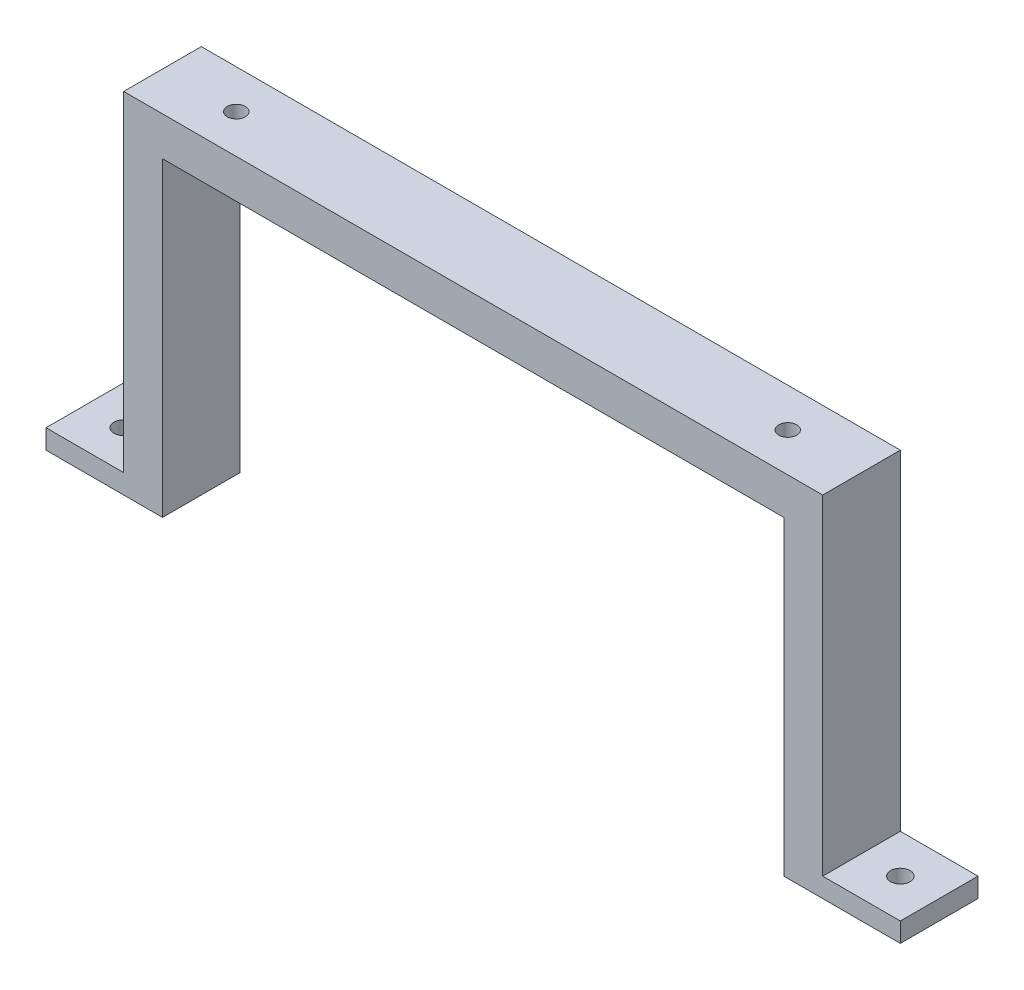
ISO-10303-21;
HEADER;
FILE_DESCRIPTION(('STEP AP214'),'2;1');
FILE_NAME('part.step','',(''),(''),'','','');
FILE_SCHEMA(('AUTOMOTIVE_DESIGN { 1 0 10303 214 1 1 1 1 }'));
ENDSEC;
DATA;
#1=APPLICATION_CONTEXT('core data for automotive mechanical design processes');
#2=APPLICATION_PROTOCOL_DEFINITION('international standard','automotive_design',2000,#1);
#3=PRODUCT_CONTEXT('',#1,'mechanical');
#4=PRODUCT('Part','Part','',(#3));
#5=PRODUCT_RELATED_PRODUCT_CATEGORY('part','',(#4));
#6=PRODUCT_DEFINITION_FORMATION('','',#4);
#7=PRODUCT_DEFINITION_CONTEXT('part definition',#1,'design');
#8=PRODUCT_DEFINITION('design','',#6,#7);
#9=PRODUCT_DEFINITION_SHAPE('','',#8);
#10=(LENGTH_UNIT() NAMED_UNIT(*) SI_UNIT(.MILLI.,.METRE.));
#11=(NAMED_UNIT(*) PLANE_ANGLE_UNIT() SI_UNIT($,.RADIAN.));
#12=(NAMED_UNIT(*) SI_UNIT($,.STERADIAN.) SOLID_ANGLE_UNIT());
#13=UNCERTAINTY_MEASURE_WITH_UNIT(LENGTH_MEASURE(1.E-05),#10,'distance_accuracy_value','');
#14=(GEOMETRIC_REPRESENTATION_CONTEXT(3) GLOBAL_UNCERTAINTY_ASSIGNED_CONTEXT((#13)) GLOBAL_UNIT_ASSIGNED_CONTEXT((#10,
#11,#12)) REPRESENTATION_CONTEXT('',''));
#15=CARTESIAN_POINT('',(0.,0.,0.));
#16=DIRECTION('',(0.,0.,1.));
#17=DIRECTION('',(1.,0.,0.));
#18=AXIS2_PLACEMENT_3D('',#15,#16,#17);
#19=CARTESIAN_POINT('',(-57.15,6.35,-6.35));
#20=DIRECTION('',(1.,0.,0.));
#21=DIRECTION('',(0.,0.,-1.));
#22=AXIS2_PLACEMENT_3D('',#19,#20,#21);
#23=PLANE('',#22);
#24=DIRECTION('',(0.,0.,-1.));
#25=VECTOR('',#24,1.);
#26=CARTESIAN_POINT('',(-57.15,-47.625,-6.35));
#27=LINE('',#26,#25);
#28=CARTESIAN_POINT('',(-57.15,-47.625,6.35));
#29=VERTEX_POINT('',#28);
#30=CARTESIAN_POINT('',(-57.15,-47.625,-6.35));
#31=VERTEX_POINT('',#30);
#32=EDGE_CURVE('E56',#29,#31,#27,.T.);
#33=ORIENTED_EDGE('',*,*,#32,.F.);
#34=DIRECTION('',(0.,-1.,0.));
#35=VECTOR('',#34,1.);
#36=CARTESIAN_POINT('',(-57.15,6.35,6.35));
#37=LINE('',#36,#35);
#38=CARTESIAN_POINT('',(-57.15,6.35,6.35));
#39=VERTEX_POINT('',#38);
#40=EDGE_CURVE('E214',#39,#29,#37,.T.);
#41=ORIENTED_EDGE('',*,*,#40,.F.);
#42=DIRECTION('',(0.,0.,1.));
#43=VECTOR('',#42,1.);
#44=CARTESIAN_POINT('',(-57.15,6.35,-6.35));
#45=LINE('',#44,#43);
#46=CARTESIAN_POINT('',(-57.15,6.35,-6.35));
#47=VERTEX_POINT('',#46);
#48=EDGE_CURVE('E204',#47,#39,#45,.T.);
#49=ORIENTED_EDGE('',*,*,#48,.F.);
#50=DIRECTION('',(0.,-1.,0.));
#51=VECTOR('',#50,1.);
#52=CARTESIAN_POINT('',(-57.15,6.35,-6.35));
#53=LINE('',#52,#51);
#54=EDGE_CURVE('E41',#47,#31,#53,.T.);
#55=ORIENTED_EDGE('',*,*,#54,.T.);
#56=EDGE_LOOP('',(#33,#41,#49,#55));
#57=FACE_BOUND('',#56,.T.);
#58=ADVANCED_FACE('F33',(#57),#23,.F.);
#59=CARTESIAN_POINT('',(0.,0.,0.));
#60=DIRECTION('',(0.,1.,0.));
#61=DIRECTION('',(0.,0.,1.));
#62=AXIS2_PLACEMENT_3D('',#59,#60,#61);
#63=PLANE('',#62);
#64=CARTESIAN_POINT('',(-45.085,0.,0.));
#65=DIRECTION('',(0.,1.,0.));
#66=DIRECTION('',(0.,0.,1.));
#67=AXIS2_PLACEMENT_3D('',#64,#65,#66);
#68=CIRCLE('',#67,1.4732);
#69=CARTESIAN_POINT('',(-45.085,0.,1.4732));
#70=VERTEX_POINT('',#69);
#71=EDGE_CURVE('E305',#70,#70,#68,.F.);
#72=ORIENTED_EDGE('',*,*,#71,.F.);
#73=EDGE_LOOP('',(#72));
#74=FACE_BOUND('',#73,.T.);
#75=CARTESIAN_POINT('',(45.085,0.,0.));
#76=DIRECTION('',(0.,1.,0.));
#77=DIRECTION('',(0.,0.,1.));
#78=AXIS2_PLACEMENT_3D('',#75,#76,#77);
#79=CIRCLE('',#78,1.4732);
#80=CARTESIAN_POINT('',(45.085,0.,1.4732));
#81=VERTEX_POINT('',#80);
#82=EDGE_CURVE('E311',#81,#81,#79,.F.);
#83=ORIENTED_EDGE('',*,*,#82,.F.);
#84=EDGE_LOOP('',(#83));
#85=FACE_BOUND('',#84,.T.);
#86=DIRECTION('',(-1.,0.,0.));
#87=VECTOR('',#86,1.);
#88=CARTESIAN_POINT('',(-57.15,0.,-6.35));
#89=LINE('',#88,#87);
#90=CARTESIAN_POINT('',(50.8,0.,-6.35));
#91=VERTEX_POINT('',#90);
#92=CARTESIAN_POINT('',(-50.8,0.,-6.35));
#93=VERTEX_POINT('',#92);
#94=EDGE_CURVE('E197',#91,#93,#89,.T.);
#95=ORIENTED_EDGE('',*,*,#94,.F.);
#96=DIRECTION('',(0.,0.,1.));
#97=VECTOR('',#96,1.);
#98=CARTESIAN_POINT('',(50.8,0.,6.35));
#99=LINE('',#98,#97);
#100=CARTESIAN_POINT('',(50.8,0.,6.35));
#101=VERTEX_POINT('',#100);
#102=EDGE_CURVE('E129',#91,#101,#99,.T.);
#103=ORIENTED_EDGE('',*,*,#102,.T.);
#104=DIRECTION('',(1.,0.,0.));
#105=VECTOR('',#104,1.);
#106=CARTESIAN_POINT('',(-57.15,0.,6.35));
#107=LINE('',#106,#105);
#108=CARTESIAN_POINT('',(-50.8,0.,6.35));
#109=VERTEX_POINT('',#108);
#110=EDGE_CURVE('E202',#109,#101,#107,.T.);
#111=ORIENTED_EDGE('',*,*,#110,.F.);
#112=DIRECTION('',(0.,0.,1.));
#113=VECTOR('',#112,1.);
#114=CARTESIAN_POINT('',(-50.8,0.,6.35));
#115=LINE('',#114,#113);
#116=EDGE_CURVE('E182',#93,#109,#115,.T.);
#117=ORIENTED_EDGE('',*,*,#116,.F.);
#118=EDGE_LOOP('',(#95,#103,#111,#117));
#119=FACE_BOUND('',#118,.T.);
#120=ADVANCED_FACE('F238',(#74,#85,#119),#63,.F.);
#121=CARTESIAN_POINT('',(57.15,6.35,-6.35));
#122=DIRECTION('',(-1.,0.,0.));
#123=DIRECTION('',(0.,0.,1.));
#124=AXIS2_PLACEMENT_3D('',#121,#122,#123);
#125=PLANE('',#124);
#126=DIRECTION('',(0.,-1.,0.));
#127=VECTOR('',#126,1.);
#128=CARTESIAN_POINT('',(57.15,6.35,6.35));
#129=LINE('',#128,#127);
#130=CARTESIAN_POINT('',(57.15,6.35,6.35));
#131=VERTEX_POINT('',#130);
#132=CARTESIAN_POINT('',(57.15,-47.625,6.35));
#133=VERTEX_POINT('',#132);
#134=EDGE_CURVE('E208',#131,#133,#129,.T.);
#135=ORIENTED_EDGE('',*,*,#134,.T.);
#136=DIRECTION('',(0.,0.,-1.));
#137=VECTOR('',#136,1.);
#138=CARTESIAN_POINT('',(57.15,-47.625,-6.35));
#139=LINE('',#138,#137);
#140=CARTESIAN_POINT('',(57.15,-47.625,-6.35));
#141=VERTEX_POINT('',#140);
#142=EDGE_CURVE('E140',#133,#141,#139,.T.);
#143=ORIENTED_EDGE('',*,*,#142,.T.);
#144=DIRECTION('',(0.,-1.,0.));
#145=VECTOR('',#144,1.);
#146=CARTESIAN_POINT('',(57.15,6.35,-6.35));
#147=LINE('',#146,#145);
#148=CARTESIAN_POINT('',(57.15,6.35,-6.35));
#149=VERTEX_POINT('',#148);
#150=EDGE_CURVE('E11',#149,#141,#147,.T.);
#151=ORIENTED_EDGE('',*,*,#150,.F.);
#152=DIRECTION('',(0.,0.,-1.));
#153=VECTOR('',#152,1.);
#154=CARTESIAN_POINT('',(57.15,6.35,-6.35));
#155=LINE('',#154,#153);
#156=EDGE_CURVE('E198',#131,#149,#155,.T.);
#157=ORIENTED_EDGE('',*,*,#156,.F.);
#158=EDGE_LOOP('',(#135,#143,#151,#157));
#159=FACE_BOUND('',#158,.T.);
#160=ADVANCED_FACE('F35',(#159),#125,.F.);
#161=CARTESIAN_POINT('',(-57.15,6.35,-6.35));
#162=DIRECTION('',(0.,0.,1.));
#163=DIRECTION('',(1.,0.,0.));
#164=AXIS2_PLACEMENT_3D('',#161,#162,#163);
#165=PLANE('',#164);
#166=ORIENTED_EDGE('',*,*,#150,.T.);
#167=DIRECTION('',(-1.,0.,0.));
#168=VECTOR('',#167,1.);
#169=CARTESIAN_POINT('',(69.85,-47.625,-6.35));
#170=LINE('',#169,#168);
#171=CARTESIAN_POINT('',(69.85,-47.625,-6.35));
#172=VERTEX_POINT('',#171);
#173=EDGE_CURVE('E48',#172,#141,#170,.T.);
#174=ORIENTED_EDGE('',*,*,#173,.F.);
#175=DIRECTION('',(0.,-1.,0.));
#176=VECTOR('',#175,1.);
#177=CARTESIAN_POINT('',(69.85,-50.8,-6.35));
#178=LINE('',#177,#176);
#179=CARTESIAN_POINT('',(69.85,-50.8,-6.35));
#180=VERTEX_POINT('',#179);
#181=EDGE_CURVE('E126',#172,#180,#178,.T.);
#182=ORIENTED_EDGE('',*,*,#181,.T.);
#183=DIRECTION('',(-1.,0.,0.));
#184=VECTOR('',#183,1.);
#185=CARTESIAN_POINT('',(57.15,-50.8,-6.35));
#186=LINE('',#185,#184);
#187=CARTESIAN_POINT('',(50.8,-50.8,-6.35));
#188=VERTEX_POINT('',#187);
#189=EDGE_CURVE('E157',#180,#188,#186,.T.);
#190=ORIENTED_EDGE('',*,*,#189,.T.);
#191=DIRECTION('',(0.,1.,0.));
#192=VECTOR('',#191,1.);
#193=CARTESIAN_POINT('',(50.8,-50.8,-6.35));
#194=LINE('',#193,#192);
#195=EDGE_CURVE('E159',#188,#91,#194,.T.);
#196=ORIENTED_EDGE('',*,*,#195,.T.);
#197=ORIENTED_EDGE('',*,*,#94,.T.);
#198=DIRECTION('',(0.,1.,0.));
#199=VECTOR('',#198,1.);
#200=CARTESIAN_POINT('',(-50.8,-50.8,-6.35));
#201=LINE('',#200,#199);
#202=CARTESIAN_POINT('',(-50.8,-50.8,-6.35));
#203=VERTEX_POINT('',#202);
#204=EDGE_CURVE('E194',#203,#93,#201,.T.);
#205=ORIENTED_EDGE('',*,*,#204,.F.);
#206=DIRECTION('',(1.,0.,0.));
#207=VECTOR('',#206,1.);
#208=CARTESIAN_POINT('',(-57.15,-50.8,-6.35));
#209=LINE('',#208,#207);
#210=CARTESIAN_POINT('',(-69.85,-50.8,-6.35));
#211=VERTEX_POINT('',#210);
#212=EDGE_CURVE('E183',#211,#203,#209,.T.);
#213=ORIENTED_EDGE('',*,*,#212,.F.);
#214=DIRECTION('',(0.,-1.,0.));
#215=VECTOR('',#214,1.);
#216=CARTESIAN_POINT('',(-69.85,-50.8,-6.35));
#217=LINE('',#216,#215);
#218=CARTESIAN_POINT('',(-69.85,-47.625,-6.35));
#219=VERTEX_POINT('',#218);
#220=EDGE_CURVE('E165',#219,#211,#217,.T.);
#221=ORIENTED_EDGE('',*,*,#220,.F.);
#222=DIRECTION('',(1.,0.,0.));
#223=VECTOR('',#222,1.);
#224=CARTESIAN_POINT('',(-69.85,-47.625,-6.35));
#225=LINE('',#224,#223);
#226=EDGE_CURVE('E175',#219,#31,#225,.T.);
#227=ORIENTED_EDGE('',*,*,#226,.T.);
#228=ORIENTED_EDGE('',*,*,#54,.F.);
#229=DIRECTION('',(-1.,0.,0.));
#230=VECTOR('',#229,1.);
#231=CARTESIAN_POINT('',(-57.15,6.35,-6.35));
#232=LINE('',#231,#230);
#233=EDGE_CURVE('E201',#149,#47,#232,.T.);
#234=ORIENTED_EDGE('',*,*,#233,.F.);
#235=EDGE_LOOP('',(#166,#174,#182,#190,#196,#197,#205,#213,#221,#227,#228,#234));
#236=FACE_BOUND('',#235,.T.);
#237=ADVANCED_FACE('F124',(#236),#165,.F.);
#238=CARTESIAN_POINT('',(-57.15,6.35,6.35));
#239=DIRECTION('',(0.,0.,-1.));
#240=DIRECTION('',(-1.,0.,0.));
#241=AXIS2_PLACEMENT_3D('',#238,#239,#240);
#242=PLANE('',#241);
#243=ORIENTED_EDGE('',*,*,#40,.T.);
#244=DIRECTION('',(1.,0.,0.));
#245=VECTOR('',#244,1.);
#246=CARTESIAN_POINT('',(-69.85,-47.625,6.35));
#247=LINE('',#246,#245);
#248=CARTESIAN_POINT('',(-69.85,-47.625,6.35));
#249=VERTEX_POINT('',#248);
#250=EDGE_CURVE('E179',#249,#29,#247,.T.);
#251=ORIENTED_EDGE('',*,*,#250,.F.);
#252=DIRECTION('',(0.,1.,0.));
#253=VECTOR('',#252,1.);
#254=CARTESIAN_POINT('',(-69.85,-50.8,6.35));
#255=LINE('',#254,#253);
#256=CARTESIAN_POINT('',(-69.85,-50.8,6.35));
#257=VERTEX_POINT('',#256);
#258=EDGE_CURVE('E171',#257,#249,#255,.T.);
#259=ORIENTED_EDGE('',*,*,#258,.F.);
#260=DIRECTION('',(-1.,0.,0.));
#261=VECTOR('',#260,1.);
#262=CARTESIAN_POINT('',(-57.15,-50.8,6.35));
#263=LINE('',#262,#261);
#264=CARTESIAN_POINT('',(-50.8,-50.8,6.35));
#265=VERTEX_POINT('',#264);
#266=EDGE_CURVE('E187',#265,#257,#263,.T.);
#267=ORIENTED_EDGE('',*,*,#266,.F.);
#268=DIRECTION('',(0.,1.,0.));
#269=VECTOR('',#268,1.);
#270=CARTESIAN_POINT('',(-50.8,-50.8,6.35));
#271=LINE('',#270,#269);
#272=EDGE_CURVE('E189',#265,#109,#271,.T.);
#273=ORIENTED_EDGE('',*,*,#272,.T.);
#274=ORIENTED_EDGE('',*,*,#110,.T.);
#275=DIRECTION('',(0.,1.,0.));
#276=VECTOR('',#275,1.);
#277=CARTESIAN_POINT('',(50.8,-50.8,6.35));
#278=LINE('',#277,#276);
#279=CARTESIAN_POINT('',(50.8,-50.8,6.35));
#280=VERTEX_POINT('',#279);
#281=EDGE_CURVE('E163',#280,#101,#278,.T.);
#282=ORIENTED_EDGE('',*,*,#281,.F.);
#283=DIRECTION('',(1.,0.,0.));
#284=VECTOR('',#283,1.);
#285=CARTESIAN_POINT('',(57.15,-50.8,6.35));
#286=LINE('',#285,#284);
#287=CARTESIAN_POINT('',(69.85,-50.8,6.35));
#288=VERTEX_POINT('',#287);
#289=EDGE_CURVE('E152',#280,#288,#286,.T.);
#290=ORIENTED_EDGE('',*,*,#289,.T.);
#291=DIRECTION('',(0.,1.,0.));
#292=VECTOR('',#291,1.);
#293=CARTESIAN_POINT('',(69.85,-50.8,6.35));
#294=LINE('',#293,#292);
#295=CARTESIAN_POINT('',(69.85,-47.625,6.35));
#296=VERTEX_POINT('',#295);
#297=EDGE_CURVE('E143',#288,#296,#294,.T.);
#298=ORIENTED_EDGE('',*,*,#297,.T.);
#299=DIRECTION('',(-1.,0.,0.));
#300=VECTOR('',#299,1.);
#301=CARTESIAN_POINT('',(69.85,-47.625,6.35));
#302=LINE('',#301,#300);
#303=EDGE_CURVE('E130',#296,#133,#302,.T.);
#304=ORIENTED_EDGE('',*,*,#303,.T.);
#305=ORIENTED_EDGE('',*,*,#134,.F.);
#306=DIRECTION('',(1.,0.,0.));
#307=VECTOR('',#306,1.);
#308=CARTESIAN_POINT('',(-57.15,6.35,6.35));
#309=LINE('',#308,#307);
#310=EDGE_CURVE('E206',#39,#131,#309,.T.);
#311=ORIENTED_EDGE('',*,*,#310,.F.);
#312=EDGE_LOOP('',(#243,#251,#259,#267,#273,#274,#282,#290,#298,#304,#305,#311));
#313=FACE_BOUND('',#312,.T.);
#314=ADVANCED_FACE('F230',(#313),#242,.F.);
#315=CARTESIAN_POINT('',(0.,6.35,0.));
#316=DIRECTION('',(0.,1.,0.));
#317=DIRECTION('',(0.,0.,1.));
#318=AXIS2_PLACEMENT_3D('',#315,#316,#317);
#319=PLANE('',#318);
#320=CARTESIAN_POINT('',(-45.085,6.35,0.));
#321=DIRECTION('',(0.,1.,0.));
#322=DIRECTION('',(0.,0.,1.));
#323=AXIS2_PLACEMENT_3D('',#320,#321,#322);
#324=CIRCLE('',#323,1.4732);
#325=CARTESIAN_POINT('',(-45.085,6.35,1.4732));
#326=VERTEX_POINT('',#325);
#327=EDGE_CURVE('E302',#326,#326,#324,.T.);
#328=ORIENTED_EDGE('',*,*,#327,.F.);
#329=EDGE_LOOP('',(#328));
#330=FACE_BOUND('',#329,.T.);
#331=CARTESIAN_POINT('',(45.085,6.35,0.));
#332=DIRECTION('',(0.,1.,0.));
#333=DIRECTION('',(0.,0.,1.));
#334=AXIS2_PLACEMENT_3D('',#331,#332,#333);
#335=CIRCLE('',#334,1.4732);
#336=CARTESIAN_POINT('',(45.085,6.35,1.4732));
#337=VERTEX_POINT('',#336);
#338=EDGE_CURVE('E314',#337,#337,#335,.T.);
#339=ORIENTED_EDGE('',*,*,#338,.F.);
#340=EDGE_LOOP('',(#339));
#341=FACE_BOUND('',#340,.T.);
#342=ORIENTED_EDGE('',*,*,#156,.T.);
#343=ORIENTED_EDGE('',*,*,#233,.T.);
#344=ORIENTED_EDGE('',*,*,#48,.T.);
#345=ORIENTED_EDGE('',*,*,#310,.T.);
#346=EDGE_LOOP('',(#342,#343,#344,#345));
#347=FACE_BOUND('',#346,.T.);
#348=ADVANCED_FACE('F235',(#330,#341,#347),#319,.T.);
#349=CARTESIAN_POINT('',(-50.8,-50.8,6.35));
#350=DIRECTION('',(-1.,0.,0.));
#351=DIRECTION('',(0.,0.,1.));
#352=AXIS2_PLACEMENT_3D('',#349,#350,#351);
#353=PLANE('',#352);
#354=ORIENTED_EDGE('',*,*,#116,.T.);
#355=ORIENTED_EDGE('',*,*,#272,.F.);
#356=DIRECTION('',(0.,0.,1.));
#357=VECTOR('',#356,1.);
#358=CARTESIAN_POINT('',(-50.8,-50.8,6.35));
#359=LINE('',#358,#357);
#360=EDGE_CURVE('E185',#203,#265,#359,.T.);
#361=ORIENTED_EDGE('',*,*,#360,.F.);
#362=ORIENTED_EDGE('',*,*,#204,.T.);
#363=EDGE_LOOP('',(#354,#355,#361,#362));
#364=FACE_BOUND('',#363,.T.);
#365=ADVANCED_FACE('F255',(#364),#353,.F.);
#366=CARTESIAN_POINT('',(0.,-50.8,0.));
#367=DIRECTION('',(0.,-1.,0.));
#368=DIRECTION('',(0.,0.,-1.));
#369=AXIS2_PLACEMENT_3D('',#366,#367,#368);
#370=PLANE('',#369);
#371=CARTESIAN_POINT('',(-63.5,-50.8,0.));
#372=DIRECTION('',(0.,-1.,0.));
#373=DIRECTION('',(0.,0.,-1.));
#374=AXIS2_PLACEMENT_3D('',#371,#372,#373);
#375=CIRCLE('',#374,1.5875);
#376=CARTESIAN_POINT('',(-63.5,-50.8,-1.5875));
#377=VERTEX_POINT('',#376);
#378=EDGE_CURVE('E321',#377,#377,#375,.F.);
#379=ORIENTED_EDGE('',*,*,#378,.T.);
#380=EDGE_LOOP('',(#379));
#381=FACE_BOUND('',#380,.T.);
#382=ORIENTED_EDGE('',*,*,#266,.T.);
#383=DIRECTION('',(0.,0.,1.));
#384=VECTOR('',#383,1.);
#385=CARTESIAN_POINT('',(-69.85,-50.8,-6.35));
#386=LINE('',#385,#384);
#387=EDGE_CURVE('E168',#211,#257,#386,.T.);
#388=ORIENTED_EDGE('',*,*,#387,.F.);
#389=ORIENTED_EDGE('',*,*,#212,.T.);
#390=ORIENTED_EDGE('',*,*,#360,.T.);
#391=EDGE_LOOP('',(#382,#388,#389,#390));
#392=FACE_BOUND('',#391,.T.);
#393=ADVANCED_FACE('F259',(#381,#392),#370,.T.);
#394=CARTESIAN_POINT('',(-69.85,-47.625,-6.35));
#395=DIRECTION('',(0.,-1.,0.));
#396=DIRECTION('',(0.,0.,-1.));
#397=AXIS2_PLACEMENT_3D('',#394,#395,#396);
#398=PLANE('',#397);
#399=CARTESIAN_POINT('',(-63.5,-47.625,0.));
#400=DIRECTION('',(0.,1.,0.));
#401=DIRECTION('',(0.,0.,1.));
#402=AXIS2_PLACEMENT_3D('',#399,#400,#401);
#403=CIRCLE('',#402,1.5875);
#404=CARTESIAN_POINT('',(-63.5,-47.625,1.5875));
#405=VERTEX_POINT('',#404);
#406=EDGE_CURVE('E150',#405,#405,#403,.T.);
#407=ORIENTED_EDGE('',*,*,#406,.F.);
#408=EDGE_LOOP('',(#407));
#409=FACE_BOUND('',#408,.T.);
#410=ORIENTED_EDGE('',*,*,#32,.T.);
#411=ORIENTED_EDGE('',*,*,#226,.F.);
#412=DIRECTION('',(0.,0.,-1.));
#413=VECTOR('',#412,1.);
#414=CARTESIAN_POINT('',(-69.85,-47.625,-6.35));
#415=LINE('',#414,#413);
#416=EDGE_CURVE('E173',#249,#219,#415,.T.);
#417=ORIENTED_EDGE('',*,*,#416,.F.);
#418=ORIENTED_EDGE('',*,*,#250,.T.);
#419=EDGE_LOOP('',(#410,#411,#417,#418));
#420=FACE_BOUND('',#419,.T.);
#421=ADVANCED_FACE('F219',(#409,#420),#398,.F.);
#422=CARTESIAN_POINT('',(-69.85,0.,0.));
#423=DIRECTION('',(1.,0.,0.));
#424=DIRECTION('',(0.,0.,-1.));
#425=AXIS2_PLACEMENT_3D('',#422,#423,#424);
#426=PLANE('',#425);
#427=ORIENTED_EDGE('',*,*,#220,.T.);
#428=ORIENTED_EDGE('',*,*,#387,.T.);
#429=ORIENTED_EDGE('',*,*,#258,.T.);
#430=ORIENTED_EDGE('',*,*,#416,.T.);
#431=EDGE_LOOP('',(#427,#428,#429,#430));
#432=FACE_BOUND('',#431,.T.);
#433=ADVANCED_FACE('F226',(#432),#426,.F.);
#434=CARTESIAN_POINT('',(50.8,-50.8,6.35));
#435=DIRECTION('',(-1.,0.,0.));
#436=DIRECTION('',(0.,0.,1.));
#437=AXIS2_PLACEMENT_3D('',#434,#435,#436);
#438=PLANE('',#437);
#439=ORIENTED_EDGE('',*,*,#102,.F.);
#440=ORIENTED_EDGE('',*,*,#195,.F.);
#441=DIRECTION('',(0.,0.,1.));
#442=VECTOR('',#441,1.);
#443=CARTESIAN_POINT('',(50.8,-50.8,6.35));
#444=LINE('',#443,#442);
#445=EDGE_CURVE('E154',#188,#280,#444,.T.);
#446=ORIENTED_EDGE('',*,*,#445,.T.);
#447=ORIENTED_EDGE('',*,*,#281,.T.);
#448=EDGE_LOOP('',(#439,#440,#446,#447));
#449=FACE_BOUND('',#448,.T.);
#450=ADVANCED_FACE('F269',(#449),#438,.T.);
#451=CARTESIAN_POINT('',(0.,-50.8,0.));
#452=DIRECTION('',(0.,-1.,0.));
#453=DIRECTION('',(0.,0.,-1.));
#454=AXIS2_PLACEMENT_3D('',#451,#452,#453);
#455=PLANE('',#454);
#456=CARTESIAN_POINT('',(63.5,-50.8,0.));
#457=DIRECTION('',(0.,-1.,0.));
#458=DIRECTION('',(0.,0.,-1.));
#459=AXIS2_PLACEMENT_3D('',#456,#457,#458);
#460=CIRCLE('',#459,1.5875);
#461=CARTESIAN_POINT('',(63.5,-50.8,-1.5875));
#462=VERTEX_POINT('',#461);
#463=EDGE_CURVE('E309',#462,#462,#460,.T.);
#464=ORIENTED_EDGE('',*,*,#463,.F.);
#465=EDGE_LOOP('',(#464));
#466=FACE_BOUND('',#465,.T.);
#467=ORIENTED_EDGE('',*,*,#189,.F.);
#468=DIRECTION('',(0.,0.,1.));
#469=VECTOR('',#468,1.);
#470=CARTESIAN_POINT('',(69.85,-50.8,-6.35));
#471=LINE('',#470,#469);
#472=EDGE_CURVE('E139',#180,#288,#471,.T.);
#473=ORIENTED_EDGE('',*,*,#472,.T.);
#474=ORIENTED_EDGE('',*,*,#289,.F.);
#475=ORIENTED_EDGE('',*,*,#445,.F.);
#476=EDGE_LOOP('',(#467,#473,#474,#475));
#477=FACE_BOUND('',#476,.T.);
#478=ADVANCED_FACE('F272',(#466,#477),#455,.T.);
#479=CARTESIAN_POINT('',(69.85,-47.625,-6.35));
#480=DIRECTION('',(0.,1.,0.));
#481=DIRECTION('',(0.,0.,1.));
#482=AXIS2_PLACEMENT_3D('',#479,#480,#481);
#483=PLANE('',#482);
#484=CARTESIAN_POINT('',(63.5,-47.625,0.));
#485=DIRECTION('',(0.,-1.,0.));
#486=DIRECTION('',(0.,0.,1.));
#487=AXIS2_PLACEMENT_3D('',#484,#485,#486);
#488=CIRCLE('',#487,1.5875);
#489=CARTESIAN_POINT('',(63.5,-47.625,1.5875));
#490=VERTEX_POINT('',#489);
#491=EDGE_CURVE('E306',#490,#490,#488,.T.);
#492=ORIENTED_EDGE('',*,*,#491,.T.);
#493=EDGE_LOOP('',(#492));
#494=FACE_BOUND('',#493,.T.);
#495=ORIENTED_EDGE('',*,*,#142,.F.);
#496=ORIENTED_EDGE('',*,*,#303,.F.);
#497=DIRECTION('',(0.,0.,-1.));
#498=VECTOR('',#497,1.);
#499=CARTESIAN_POINT('',(69.85,-47.625,-6.35));
#500=LINE('',#499,#498);
#501=EDGE_CURVE('E136',#296,#172,#500,.T.);
#502=ORIENTED_EDGE('',*,*,#501,.T.);
#503=ORIENTED_EDGE('',*,*,#173,.T.);
#504=EDGE_LOOP('',(#495,#496,#502,#503));
#505=FACE_BOUND('',#504,.T.);
#506=ADVANCED_FACE('F142',(#494,#505),#483,.T.);
#507=CARTESIAN_POINT('',(69.85,0.,0.));
#508=DIRECTION('',(-1.,0.,0.));
#509=DIRECTION('',(0.,0.,-1.));
#510=AXIS2_PLACEMENT_3D('',#507,#508,#509);
#511=PLANE('',#510);
#512=ORIENTED_EDGE('',*,*,#181,.F.);
#513=ORIENTED_EDGE('',*,*,#501,.F.);
#514=ORIENTED_EDGE('',*,*,#297,.F.);
#515=ORIENTED_EDGE('',*,*,#472,.F.);
#516=EDGE_LOOP('',(#512,#513,#514,#515));
#517=FACE_BOUND('',#516,.T.);
#518=ADVANCED_FACE('F134',(#517),#511,.F.);
#519=CARTESIAN_POINT('',(-63.5,-50.801,0.));
#520=DIRECTION('',(0.,1.,0.));
#521=DIRECTION('',(0.,0.,1.));
#522=AXIS2_PLACEMENT_3D('',#519,#520,#521);
#523=CYLINDRICAL_SURFACE('',#522,1.5875);
#524=ORIENTED_EDGE('',*,*,#378,.F.);
#525=EDGE_LOOP('',(#524));
#526=FACE_BOUND('',#525,.T.);
#527=ORIENTED_EDGE('',*,*,#406,.T.);
#528=EDGE_LOOP('',(#527));
#529=FACE_BOUND('',#528,.T.);
#530=ADVANCED_FACE('F282',(#526,#529),#523,.F.);
#531=CARTESIAN_POINT('',(63.5,-50.801,0.));
#532=DIRECTION('',(0.,1.,0.));
#533=DIRECTION('',(0.,0.,1.));
#534=AXIS2_PLACEMENT_3D('',#531,#532,#533);
#535=CYLINDRICAL_SURFACE('',#534,1.5875);
#536=ORIENTED_EDGE('',*,*,#463,.T.);
#537=EDGE_LOOP('',(#536));
#538=FACE_BOUND('',#537,.T.);
#539=ORIENTED_EDGE('',*,*,#491,.F.);
#540=EDGE_LOOP('',(#539));
#541=FACE_BOUND('',#540,.T.);
#542=ADVANCED_FACE('F285',(#538,#541),#535,.F.);
#543=CARTESIAN_POINT('',(45.085,-50.801,0.));
#544=DIRECTION('',(0.,1.,0.));
#545=DIRECTION('',(0.,0.,1.));
#546=AXIS2_PLACEMENT_3D('',#543,#544,#545);
#547=CYLINDRICAL_SURFACE('',#546,1.4732);
#548=ORIENTED_EDGE('',*,*,#338,.T.);
#549=EDGE_LOOP('',(#548));
#550=FACE_BOUND('',#549,.T.);
#551=ORIENTED_EDGE('',*,*,#82,.T.);
#552=EDGE_LOOP('',(#551));
#553=FACE_BOUND('',#552,.T.);
#554=ADVANCED_FACE('F289',(#550,#553),#547,.F.);
#555=CARTESIAN_POINT('',(-45.085,-50.801,0.));
#556=DIRECTION('',(0.,1.,0.));
#557=DIRECTION('',(0.,0.,1.));
#558=AXIS2_PLACEMENT_3D('',#555,#556,#557);
#559=CYLINDRICAL_SURFACE('',#558,1.4732);
#560=ORIENTED_EDGE('',*,*,#327,.T.);
#561=EDGE_LOOP('',(#560));
#562=FACE_BOUND('',#561,.T.);
#563=ORIENTED_EDGE('',*,*,#71,.T.);
#564=EDGE_LOOP('',(#563));
#565=FACE_BOUND('',#564,.T.);
#566=ADVANCED_FACE('F293',(#562,#565),#559,.F.);
#567=CLOSED_SHELL('',(#58,#120,#160,#237,#314,#348,#365,#393,#421,#433,#450,#478,#506,#518,#530,
#542,#554,#566));
#568=MANIFOLD_SOLID_BREP('B2',#567);
#569=ADVANCED_BREP_SHAPE_REPRESENTATION('',(#18,#568),#14);
#570=SHAPE_DEFINITION_REPRESENTATION(#9,#569);
ENDSEC;
END-ISO-10303-21;
